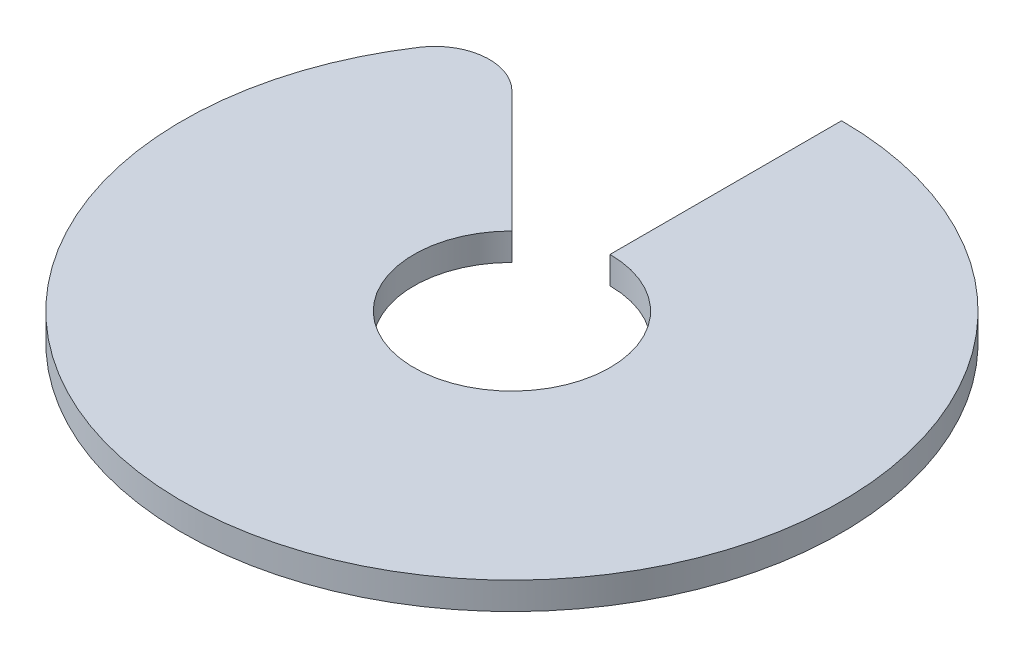
ISO-10303-21;
HEADER;
FILE_DESCRIPTION(('STEP AP214'),'2;1');
FILE_NAME('part.step','',(''),(''),'','','');
FILE_SCHEMA(('AUTOMOTIVE_DESIGN { 1 0 10303 214 1 1 1 1 }'));
ENDSEC;
DATA;
#1=APPLICATION_CONTEXT('core data for automotive mechanical design processes');
#2=APPLICATION_PROTOCOL_DEFINITION('international standard','automotive_design',2000,#1);
#3=PRODUCT_CONTEXT('',#1,'mechanical');
#4=PRODUCT('Part','Part','',(#3));
#5=PRODUCT_RELATED_PRODUCT_CATEGORY('part','',(#4));
#6=PRODUCT_DEFINITION_FORMATION('','',#4);
#7=PRODUCT_DEFINITION_CONTEXT('part definition',#1,'design');
#8=PRODUCT_DEFINITION('design','',#6,#7);
#9=PRODUCT_DEFINITION_SHAPE('','',#8);
#10=(LENGTH_UNIT() NAMED_UNIT(*) SI_UNIT(.MILLI.,.METRE.));
#11=(NAMED_UNIT(*) PLANE_ANGLE_UNIT() SI_UNIT($,.RADIAN.));
#12=(NAMED_UNIT(*) SI_UNIT($,.STERADIAN.) SOLID_ANGLE_UNIT());
#13=UNCERTAINTY_MEASURE_WITH_UNIT(LENGTH_MEASURE(1.E-05),#10,'distance_accuracy_value','');
#14=(GEOMETRIC_REPRESENTATION_CONTEXT(3) GLOBAL_UNCERTAINTY_ASSIGNED_CONTEXT((#13)) GLOBAL_UNIT_ASSIGNED_CONTEXT((#10,
#11,#12)) REPRESENTATION_CONTEXT('',''));
#15=CARTESIAN_POINT('',(0.,0.,0.));
#16=DIRECTION('',(0.,0.,1.));
#17=DIRECTION('',(1.,0.,0.));
#18=AXIS2_PLACEMENT_3D('',#15,#16,#17);
#19=CARTESIAN_POINT('',(-12.7279220613579,5.,-12.7279220613578));
#20=DIRECTION('',(-0.707106781186543,0.,0.707106781186552));
#21=DIRECTION('',(0.707106781186552,0.,0.707106781186543));
#22=AXIS2_PLACEMENT_3D('',#19,#20,#21);
#23=PLANE('',#22);
#24=DIRECTION('',(-0.707106781186552,0.,-0.707106781186543));
#25=VECTOR('',#24,1.);
#26=CARTESIAN_POINT('',(-12.7279220613579,0.,-12.7279220613578));
#27=LINE('',#26,#25);
#28=CARTESIAN_POINT('',(-12.7279220613579,0.,-12.7279220613578));
#29=VERTEX_POINT('',#28);
#30=CARTESIAN_POINT('',(-35.0017856687343,0.,-35.0017856687339));
#31=VERTEX_POINT('',#30);
#32=EDGE_CURVE('E118',#29,#31,#27,.T.);
#33=ORIENTED_EDGE('',*,*,#32,.T.);
#34=DIRECTION('',(0.,-1.,0.));
#35=VECTOR('',#34,1.);
#36=CARTESIAN_POINT('',(-35.0017856687343,5.,-35.0017856687339));
#37=LINE('',#36,#35);
#38=CARTESIAN_POINT('',(-35.0017856687343,5.,-35.0017856687339));
#39=VERTEX_POINT('',#38);
#40=EDGE_CURVE('E47',#31,#39,#37,.F.);
#41=ORIENTED_EDGE('',*,*,#40,.T.);
#42=DIRECTION('',(-0.707106781186552,0.,-0.707106781186543));
#43=VECTOR('',#42,1.);
#44=CARTESIAN_POINT('',(-12.7279220613579,5.,-12.7279220613578));
#45=LINE('',#44,#43);
#46=CARTESIAN_POINT('',(-12.7279220613579,5.,-12.7279220613578));
#47=VERTEX_POINT('',#46);
#48=EDGE_CURVE('E97',#47,#39,#45,.T.);
#49=ORIENTED_EDGE('',*,*,#48,.F.);
#50=DIRECTION('',(0.,-1.,0.));
#51=VECTOR('',#50,1.);
#52=CARTESIAN_POINT('',(-12.7279220613579,5.,-12.7279220613578));
#53=LINE('',#52,#51);
#54=EDGE_CURVE('E114',#47,#29,#53,.T.);
#55=ORIENTED_EDGE('',*,*,#54,.T.);
#56=EDGE_LOOP('',(#33,#41,#49,#55));
#57=FACE_BOUND('',#56,.T.);
#58=ADVANCED_FACE('F41',(#57),#23,.F.);
#59=CARTESIAN_POINT('',(0.,5.,0.));
#60=DIRECTION('',(0.,-1.,0.));
#61=DIRECTION('',(0.,0.,-1.));
#62=AXIS2_PLACEMENT_3D('',#59,#60,#61);
#63=CYLINDRICAL_SURFACE('',#62,60.5);
#64=CARTESIAN_POINT('',(0.,5.,0.));
#65=DIRECTION('',(0.,1.,0.));
#66=DIRECTION('',(0.,0.,1.));
#67=AXIS2_PLACEMENT_3D('',#64,#65,#66);
#68=CIRCLE('',#67,60.5);
#69=CARTESIAN_POINT('',(-50.40411159557,5.,-33.4615530760502));
#70=VERTEX_POINT('',#69);
#71=CARTESIAN_POINT('',(0.,5.,-60.5));
#72=VERTEX_POINT('',#71);
#73=EDGE_CURVE('E89',#70,#72,#68,.T.);
#74=ORIENTED_EDGE('',*,*,#73,.F.);
#75=DIRECTION('',(0.,-1.,0.));
#76=VECTOR('',#75,1.);
#77=CARTESIAN_POINT('',(-50.40411159557,5.,-33.4615530760502));
#78=LINE('',#77,#76);
#79=CARTESIAN_POINT('',(-50.40411159557,0.,-33.4615530760502));
#80=VERTEX_POINT('',#79);
#81=EDGE_CURVE('E106',#70,#80,#78,.T.);
#82=ORIENTED_EDGE('',*,*,#81,.T.);
#83=CARTESIAN_POINT('',(0.,0.,0.));
#84=DIRECTION('',(0.,1.,0.));
#85=DIRECTION('',(0.,0.,1.));
#86=AXIS2_PLACEMENT_3D('',#83,#84,#85);
#87=CIRCLE('',#86,60.5);
#88=CARTESIAN_POINT('',(0.,0.,-60.5));
#89=VERTEX_POINT('',#88);
#90=EDGE_CURVE('E102',#80,#89,#87,.T.);
#91=ORIENTED_EDGE('',*,*,#90,.T.);
#92=DIRECTION('',(0.,-1.,0.));
#93=VECTOR('',#92,1.);
#94=CARTESIAN_POINT('',(0.,5.,-60.5));
#95=LINE('',#94,#93);
#96=EDGE_CURVE('E105',#72,#89,#95,.T.);
#97=ORIENTED_EDGE('',*,*,#96,.F.);
#98=EDGE_LOOP('',(#74,#82,#91,#97));
#99=FACE_BOUND('',#98,.T.);
#100=ADVANCED_FACE('F103',(#99),#63,.T.);
#101=CARTESIAN_POINT('',(0.,5.,-18.));
#102=DIRECTION('',(-1.,0.,0.));
#103=DIRECTION('',(0.,0.,1.));
#104=AXIS2_PLACEMENT_3D('',#101,#102,#103);
#105=PLANE('',#104);
#106=DIRECTION('',(0.,0.,-1.));
#107=VECTOR('',#106,1.);
#108=CARTESIAN_POINT('',(0.,0.,-18.));
#109=LINE('',#108,#107);
#110=CARTESIAN_POINT('',(0.,0.,-18.));
#111=VERTEX_POINT('',#110);
#112=EDGE_CURVE('E121',#111,#89,#109,.T.);
#113=ORIENTED_EDGE('',*,*,#112,.F.);
#114=DIRECTION('',(0.,-1.,0.));
#115=VECTOR('',#114,1.);
#116=CARTESIAN_POINT('',(0.,5.,-18.));
#117=LINE('',#116,#115);
#118=CARTESIAN_POINT('',(0.,5.,-18.));
#119=VERTEX_POINT('',#118);
#120=EDGE_CURVE('E110',#119,#111,#117,.T.);
#121=ORIENTED_EDGE('',*,*,#120,.F.);
#122=DIRECTION('',(0.,0.,-1.));
#123=VECTOR('',#122,1.);
#124=CARTESIAN_POINT('',(0.,5.,-18.));
#125=LINE('',#124,#123);
#126=EDGE_CURVE('E92',#119,#72,#125,.T.);
#127=ORIENTED_EDGE('',*,*,#126,.T.);
#128=ORIENTED_EDGE('',*,*,#96,.T.);
#129=EDGE_LOOP('',(#113,#121,#127,#128));
#130=FACE_BOUND('',#129,.T.);
#131=ADVANCED_FACE('F113',(#130),#105,.T.);
#132=CARTESIAN_POINT('',(0.,5.,0.));
#133=DIRECTION('',(0.,-1.,0.));
#134=DIRECTION('',(0.,0.,-1.));
#135=AXIS2_PLACEMENT_3D('',#132,#133,#134);
#136=CYLINDRICAL_SURFACE('',#135,18.);
#137=CARTESIAN_POINT('',(0.,0.,0.));
#138=DIRECTION('',(0.,1.,0.));
#139=DIRECTION('',(0.,0.,1.));
#140=AXIS2_PLACEMENT_3D('',#137,#138,#139);
#141=CIRCLE('',#140,18.);
#142=EDGE_CURVE('E123',#29,#111,#141,.T.);
#143=ORIENTED_EDGE('',*,*,#142,.F.);
#144=ORIENTED_EDGE('',*,*,#54,.F.);
#145=CARTESIAN_POINT('',(0.,5.,0.));
#146=DIRECTION('',(0.,1.,0.));
#147=DIRECTION('',(0.,0.,1.));
#148=AXIS2_PLACEMENT_3D('',#145,#146,#147);
#149=CIRCLE('',#148,18.);
#150=EDGE_CURVE('E115',#47,#119,#149,.T.);
#151=ORIENTED_EDGE('',*,*,#150,.T.);
#152=ORIENTED_EDGE('',*,*,#120,.T.);
#153=EDGE_LOOP('',(#143,#144,#151,#152));
#154=FACE_BOUND('',#153,.T.);
#155=ADVANCED_FACE('F134',(#154),#136,.F.);
#156=CARTESIAN_POINT('',(0.,5.,0.));
#157=DIRECTION('',(0.,1.,0.));
#158=DIRECTION('',(0.,0.,1.));
#159=AXIS2_PLACEMENT_3D('',#156,#157,#158);
#160=PLANE('',#159);
#161=ORIENTED_EDGE('',*,*,#48,.T.);
#162=CARTESIAN_POINT('',(-42.0728534805997,5.,-27.9307178568684));
#163=DIRECTION('',(0.,1.,0.));
#164=DIRECTION('',(0.,0.,1.));
#165=AXIS2_PLACEMENT_3D('',#162,#163,#164);
#166=CIRCLE('',#165,10.);
#167=EDGE_CURVE('E11',#39,#70,#166,.T.);
#168=ORIENTED_EDGE('',*,*,#167,.T.);
#169=ORIENTED_EDGE('',*,*,#73,.T.);
#170=ORIENTED_EDGE('',*,*,#126,.F.);
#171=ORIENTED_EDGE('',*,*,#150,.F.);
#172=EDGE_LOOP('',(#161,#168,#169,#170,#171));
#173=FACE_BOUND('',#172,.T.);
#174=ADVANCED_FACE('F88',(#173),#160,.T.);
#175=CARTESIAN_POINT('',(0.,0.,0.));
#176=DIRECTION('',(0.,1.,0.));
#177=DIRECTION('',(0.,0.,1.));
#178=AXIS2_PLACEMENT_3D('',#175,#176,#177);
#179=PLANE('',#178);
#180=ORIENTED_EDGE('',*,*,#90,.F.);
#181=CARTESIAN_POINT('',(-42.0728534805997,0.,-27.9307178568684));
#182=DIRECTION('',(0.,1.,0.));
#183=DIRECTION('',(0.,0.,1.));
#184=AXIS2_PLACEMENT_3D('',#181,#182,#183);
#185=CIRCLE('',#184,10.);
#186=EDGE_CURVE('E64',#80,#31,#185,.F.);
#187=ORIENTED_EDGE('',*,*,#186,.T.);
#188=ORIENTED_EDGE('',*,*,#32,.F.);
#189=ORIENTED_EDGE('',*,*,#142,.T.);
#190=ORIENTED_EDGE('',*,*,#112,.T.);
#191=EDGE_LOOP('',(#180,#187,#188,#189,#190));
#192=FACE_BOUND('',#191,.T.);
#193=ADVANCED_FACE('F129',(#192),#179,.F.);
#194=CARTESIAN_POINT('',(-42.0728534805997,5.,-27.9307178568684));
#195=DIRECTION('',(0.,-1.,0.));
#196=DIRECTION('',(0.,0.,-1.));
#197=AXIS2_PLACEMENT_3D('',#194,#195,#196);
#198=CYLINDRICAL_SURFACE('',#197,10.);
#199=ORIENTED_EDGE('',*,*,#167,.F.);
#200=ORIENTED_EDGE('',*,*,#40,.F.);
#201=ORIENTED_EDGE('',*,*,#186,.F.);
#202=ORIENTED_EDGE('',*,*,#81,.F.);
#203=EDGE_LOOP('',(#199,#200,#201,#202));
#204=FACE_BOUND('',#203,.T.);
#205=ADVANCED_FACE('F43',(#204),#198,.T.);
#206=CLOSED_SHELL('',(#58,#100,#131,#155,#174,#193,#205));
#207=MANIFOLD_SOLID_BREP('B2',#206);
#208=ADVANCED_BREP_SHAPE_REPRESENTATION('',(#18,#207),#14);
#209=SHAPE_DEFINITION_REPRESENTATION(#9,#208);
ENDSEC;
END-ISO-10303-21;
